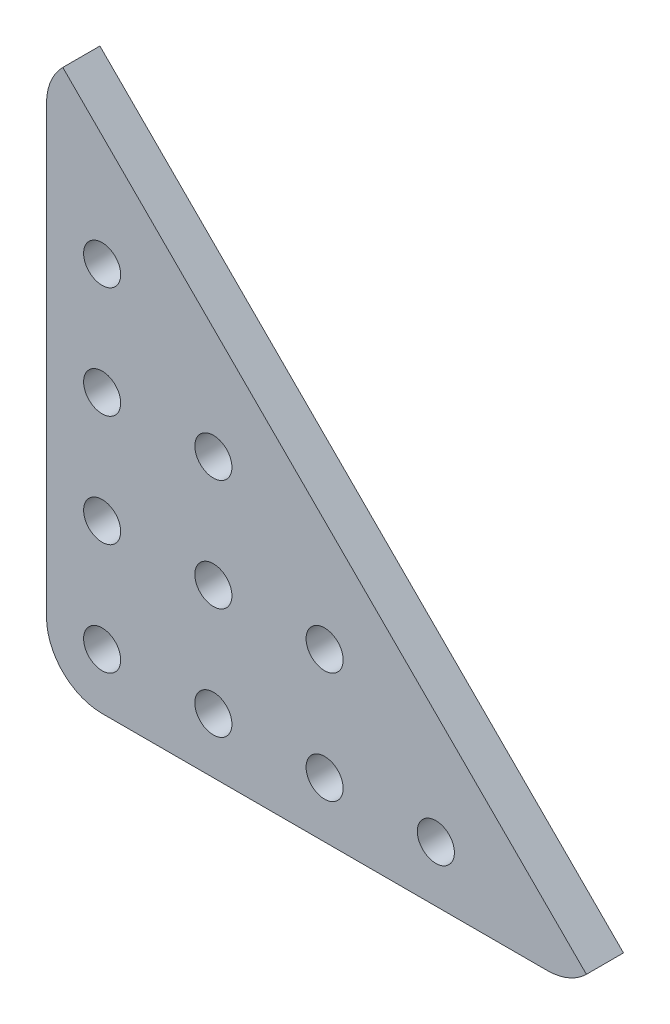
ISO-10303-21;
HEADER;
FILE_DESCRIPTION(('STEP AP214'),'2;1');
FILE_NAME('part.step','',(''),(''),'','','');
FILE_SCHEMA(('AUTOMOTIVE_DESIGN { 1 0 10303 214 1 1 1 1 }'));
ENDSEC;
DATA;
#1=APPLICATION_CONTEXT('core data for automotive mechanical design processes');
#2=APPLICATION_PROTOCOL_DEFINITION('international standard','automotive_design',2000,#1);
#3=PRODUCT_CONTEXT('',#1,'mechanical');
#4=PRODUCT('Part','Part','',(#3));
#5=PRODUCT_RELATED_PRODUCT_CATEGORY('part','',(#4));
#6=PRODUCT_DEFINITION_FORMATION('','',#4);
#7=PRODUCT_DEFINITION_CONTEXT('part definition',#1,'design');
#8=PRODUCT_DEFINITION('design','',#6,#7);
#9=PRODUCT_DEFINITION_SHAPE('','',#8);
#10=(LENGTH_UNIT() NAMED_UNIT(*) SI_UNIT(.MILLI.,.METRE.));
#11=(NAMED_UNIT(*) PLANE_ANGLE_UNIT() SI_UNIT($,.RADIAN.));
#12=(NAMED_UNIT(*) SI_UNIT($,.STERADIAN.) SOLID_ANGLE_UNIT());
#13=UNCERTAINTY_MEASURE_WITH_UNIT(LENGTH_MEASURE(1.E-05),#10,'distance_accuracy_value','');
#14=(GEOMETRIC_REPRESENTATION_CONTEXT(3) GLOBAL_UNCERTAINTY_ASSIGNED_CONTEXT((#13)) GLOBAL_UNIT_ASSIGNED_CONTEXT((#10,
#11,#12)) REPRESENTATION_CONTEXT('',''));
#15=CARTESIAN_POINT('',(0.,0.,0.));
#16=DIRECTION('',(0.,0.,1.));
#17=DIRECTION('',(1.,0.,0.));
#18=AXIS2_PLACEMENT_3D('',#15,#16,#17);
#19=CARTESIAN_POINT('',(-101.443383637,101.056539337921,3.));
#20=DIRECTION('',(0.,0.,1.));
#21=DIRECTION('',(1.,0.,0.));
#22=AXIS2_PLACEMENT_3D('',#19,#20,#21);
#23=PLANE('',#22);
#24=CARTESIAN_POINT('',(-83.443383637,65.056539338,3.));
#25=DIRECTION('',(0.,0.,1.));
#26=DIRECTION('',(1.,0.,0.));
#27=AXIS2_PLACEMENT_3D('',#24,#25,#26);
#28=CIRCLE('',#27,1.5);
#29=CARTESIAN_POINT('',(-81.943383637,65.056539338,3.));
#30=VERTEX_POINT('',#29);
#31=EDGE_CURVE('E214',#30,#30,#28,.T.);
#32=ORIENTED_EDGE('',*,*,#31,.F.);
#33=EDGE_LOOP('',(#32));
#34=FACE_BOUND('',#33,.T.);
#35=CARTESIAN_POINT('',(-101.443383637,65.056539338,3.));
#36=DIRECTION('',(0.,0.,1.));
#37=DIRECTION('',(1.,0.,0.));
#38=AXIS2_PLACEMENT_3D('',#35,#36,#37);
#39=CIRCLE('',#38,1.5);
#40=CARTESIAN_POINT('',(-99.943383637,65.056539338,3.));
#41=VERTEX_POINT('',#40);
#42=EDGE_CURVE('E226',#41,#41,#39,.T.);
#43=ORIENTED_EDGE('',*,*,#42,.F.);
#44=EDGE_LOOP('',(#43));
#45=FACE_BOUND('',#44,.T.);
#46=CARTESIAN_POINT('',(-92.443383637,74.056539338,3.));
#47=DIRECTION('',(0.,0.,1.));
#48=DIRECTION('',(1.,0.,0.));
#49=AXIS2_PLACEMENT_3D('',#46,#47,#48);
#50=CIRCLE('',#49,1.5);
#51=CARTESIAN_POINT('',(-90.943383637,74.056539338,3.));
#52=VERTEX_POINT('',#51);
#53=EDGE_CURVE('E238',#52,#52,#50,.T.);
#54=ORIENTED_EDGE('',*,*,#53,.F.);
#55=EDGE_LOOP('',(#54));
#56=FACE_BOUND('',#55,.T.);
#57=CARTESIAN_POINT('',(-92.443383637,83.056539338,3.));
#58=DIRECTION('',(0.,0.,1.));
#59=DIRECTION('',(1.,0.,0.));
#60=AXIS2_PLACEMENT_3D('',#57,#58,#59);
#61=CIRCLE('',#60,1.5);
#62=CARTESIAN_POINT('',(-90.943383637,83.056539338,3.));
#63=VERTEX_POINT('',#62);
#64=EDGE_CURVE('E250',#63,#63,#61,.T.);
#65=ORIENTED_EDGE('',*,*,#64,.F.);
#66=EDGE_LOOP('',(#65));
#67=FACE_BOUND('',#66,.T.);
#68=CARTESIAN_POINT('',(-101.443383637,92.056539338,3.));
#69=DIRECTION('',(0.,0.,1.));
#70=DIRECTION('',(1.,0.,0.));
#71=AXIS2_PLACEMENT_3D('',#68,#69,#70);
#72=CIRCLE('',#71,1.5);
#73=CARTESIAN_POINT('',(-99.943383637,92.056539338,3.));
#74=VERTEX_POINT('',#73);
#75=EDGE_CURVE('E122',#74,#74,#72,.T.);
#76=ORIENTED_EDGE('',*,*,#75,.F.);
#77=EDGE_LOOP('',(#76));
#78=FACE_BOUND('',#77,.T.);
#79=CARTESIAN_POINT('',(-101.443383637,101.056539337921,3.));
#80=DIRECTION('',(0.,0.,1.));
#81=DIRECTION('',(1.,0.,0.));
#82=AXIS2_PLACEMENT_3D('',#79,#80,#81);
#83=CIRCLE('',#82,4.50000000000001);
#84=CARTESIAN_POINT('',(-104.6253641523,104.2385198533,3.));
#85=VERTEX_POINT('',#84);
#86=CARTESIAN_POINT('',(-105.943383637,101.056539338,3.));
#87=VERTEX_POINT('',#86);
#88=EDGE_CURVE('E129',#85,#87,#83,.T.);
#89=ORIENTED_EDGE('',*,*,#88,.T.);
#90=DIRECTION('',(0.,-1.,0.));
#91=VECTOR('',#90,1.);
#92=CARTESIAN_POINT('',(-105.943383637,101.056539338,3.));
#93=LINE('',#92,#91);
#94=CARTESIAN_POINT('',(-105.943383637,65.056539338,3.));
#95=VERTEX_POINT('',#94);
#96=EDGE_CURVE('E87',#87,#95,#93,.T.);
#97=ORIENTED_EDGE('',*,*,#96,.T.);
#98=CARTESIAN_POINT('',(-101.443383637,65.056539338,3.));
#99=DIRECTION('',(0.,0.,1.));
#100=DIRECTION('',(1.,0.,0.));
#101=AXIS2_PLACEMENT_3D('',#98,#99,#100);
#102=CIRCLE('',#101,4.5);
#103=CARTESIAN_POINT('',(-101.443383637,60.556539338,3.));
#104=VERTEX_POINT('',#103);
#105=EDGE_CURVE('E100',#95,#104,#102,.T.);
#106=ORIENTED_EDGE('',*,*,#105,.T.);
#107=DIRECTION('',(1.,0.,0.));
#108=VECTOR('',#107,1.);
#109=CARTESIAN_POINT('',(-101.443383637,60.556539338,3.));
#110=LINE('',#109,#108);
#111=CARTESIAN_POINT('',(-65.443383637,60.556539338,3.));
#112=VERTEX_POINT('',#111);
#113=EDGE_CURVE('E94',#104,#112,#110,.T.);
#114=ORIENTED_EDGE('',*,*,#113,.T.);
#115=CARTESIAN_POINT('',(-65.4433836370789,65.056539338,3.));
#116=DIRECTION('',(0.,0.,1.));
#117=DIRECTION('',(1.,0.,0.));
#118=AXIS2_PLACEMENT_3D('',#115,#116,#117);
#119=CIRCLE('',#118,4.5);
#120=CARTESIAN_POINT('',(-62.2614031217,61.8745588227,3.));
#121=VERTEX_POINT('',#120);
#122=EDGE_CURVE('E98',#112,#121,#119,.T.);
#123=ORIENTED_EDGE('',*,*,#122,.T.);
#124=DIRECTION('',(-0.707106781186547,0.707106781186548,0.));
#125=VECTOR('',#124,1.);
#126=CARTESIAN_POINT('',(-104.6253641523,104.2385198533,3.));
#127=LINE('',#126,#125);
#128=EDGE_CURVE('E50',#121,#85,#127,.T.);
#129=ORIENTED_EDGE('',*,*,#128,.T.);
#130=EDGE_LOOP('',(#89,#97,#106,#114,#123,#129));
#131=FACE_BOUND('',#130,.T.);
#132=CARTESIAN_POINT('',(-101.443383637,83.056539338,3.));
#133=DIRECTION('',(0.,0.,1.));
#134=DIRECTION('',(1.,0.,0.));
#135=AXIS2_PLACEMENT_3D('',#132,#133,#134);
#136=CIRCLE('',#135,1.5);
#137=CARTESIAN_POINT('',(-99.943383637,83.056539338,3.));
#138=VERTEX_POINT('',#137);
#139=EDGE_CURVE('E256',#138,#138,#136,.T.);
#140=ORIENTED_EDGE('',*,*,#139,.F.);
#141=EDGE_LOOP('',(#140));
#142=FACE_BOUND('',#141,.T.);
#143=CARTESIAN_POINT('',(-101.443383637,74.056539338,3.));
#144=DIRECTION('',(0.,0.,1.));
#145=DIRECTION('',(1.,0.,0.));
#146=AXIS2_PLACEMENT_3D('',#143,#144,#145);
#147=CIRCLE('',#146,1.5);
#148=CARTESIAN_POINT('',(-99.943383637,74.056539338,3.));
#149=VERTEX_POINT('',#148);
#150=EDGE_CURVE('E244',#149,#149,#147,.T.);
#151=ORIENTED_EDGE('',*,*,#150,.F.);
#152=EDGE_LOOP('',(#151));
#153=FACE_BOUND('',#152,.T.);
#154=CARTESIAN_POINT('',(-83.443383637,74.056539338,3.));
#155=DIRECTION('',(0.,0.,1.));
#156=DIRECTION('',(1.,0.,0.));
#157=AXIS2_PLACEMENT_3D('',#154,#155,#156);
#158=CIRCLE('',#157,1.5);
#159=CARTESIAN_POINT('',(-81.943383637,74.056539338,3.));
#160=VERTEX_POINT('',#159);
#161=EDGE_CURVE('E232',#160,#160,#158,.T.);
#162=ORIENTED_EDGE('',*,*,#161,.F.);
#163=EDGE_LOOP('',(#162));
#164=FACE_BOUND('',#163,.T.);
#165=CARTESIAN_POINT('',(-92.443383637,65.056539338,3.));
#166=DIRECTION('',(0.,0.,1.));
#167=DIRECTION('',(1.,0.,0.));
#168=AXIS2_PLACEMENT_3D('',#165,#166,#167);
#169=CIRCLE('',#168,1.5);
#170=CARTESIAN_POINT('',(-90.943383637,65.056539338,3.));
#171=VERTEX_POINT('',#170);
#172=EDGE_CURVE('E220',#171,#171,#169,.T.);
#173=ORIENTED_EDGE('',*,*,#172,.F.);
#174=EDGE_LOOP('',(#173));
#175=FACE_BOUND('',#174,.T.);
#176=CARTESIAN_POINT('',(-74.443383637,65.056539338,3.));
#177=DIRECTION('',(0.,0.,1.));
#178=DIRECTION('',(1.,0.,0.));
#179=AXIS2_PLACEMENT_3D('',#176,#177,#178);
#180=CIRCLE('',#179,1.5);
#181=CARTESIAN_POINT('',(-72.943383637,65.056539338,3.));
#182=VERTEX_POINT('',#181);
#183=EDGE_CURVE('E205',#182,#182,#180,.T.);
#184=ORIENTED_EDGE('',*,*,#183,.F.);
#185=EDGE_LOOP('',(#184));
#186=FACE_BOUND('',#185,.T.);
#187=ADVANCED_FACE('F33',(#34,#45,#56,#67,#78,#131,#142,#153,#164,#175,#186),#23,.T.);
#188=CARTESIAN_POINT('',(-101.443383637,101.056539337921,0.));
#189=DIRECTION('',(0.,0.,1.));
#190=DIRECTION('',(1.,0.,0.));
#191=AXIS2_PLACEMENT_3D('',#188,#189,#190);
#192=PLANE('',#191);
#193=CARTESIAN_POINT('',(-83.443383637,65.056539338,0.));
#194=DIRECTION('',(0.,0.,1.));
#195=DIRECTION('',(1.,0.,0.));
#196=AXIS2_PLACEMENT_3D('',#193,#194,#195);
#197=CIRCLE('',#196,1.5);
#198=CARTESIAN_POINT('',(-81.943383637,65.056539338,0.));
#199=VERTEX_POINT('',#198);
#200=EDGE_CURVE('E211',#199,#199,#197,.T.);
#201=ORIENTED_EDGE('',*,*,#200,.T.);
#202=EDGE_LOOP('',(#201));
#203=FACE_BOUND('',#202,.T.);
#204=CARTESIAN_POINT('',(-101.443383637,65.056539338,0.));
#205=DIRECTION('',(0.,0.,1.));
#206=DIRECTION('',(1.,0.,0.));
#207=AXIS2_PLACEMENT_3D('',#204,#205,#206);
#208=CIRCLE('',#207,1.5);
#209=CARTESIAN_POINT('',(-99.943383637,65.056539338,0.));
#210=VERTEX_POINT('',#209);
#211=EDGE_CURVE('E223',#210,#210,#208,.T.);
#212=ORIENTED_EDGE('',*,*,#211,.T.);
#213=EDGE_LOOP('',(#212));
#214=FACE_BOUND('',#213,.T.);
#215=CARTESIAN_POINT('',(-92.443383637,74.056539338,0.));
#216=DIRECTION('',(0.,0.,1.));
#217=DIRECTION('',(1.,0.,0.));
#218=AXIS2_PLACEMENT_3D('',#215,#216,#217);
#219=CIRCLE('',#218,1.5);
#220=CARTESIAN_POINT('',(-90.943383637,74.056539338,0.));
#221=VERTEX_POINT('',#220);
#222=EDGE_CURVE('E235',#221,#221,#219,.T.);
#223=ORIENTED_EDGE('',*,*,#222,.T.);
#224=EDGE_LOOP('',(#223));
#225=FACE_BOUND('',#224,.T.);
#226=CARTESIAN_POINT('',(-92.443383637,83.056539338,0.));
#227=DIRECTION('',(0.,0.,1.));
#228=DIRECTION('',(1.,0.,0.));
#229=AXIS2_PLACEMENT_3D('',#226,#227,#228);
#230=CIRCLE('',#229,1.5);
#231=CARTESIAN_POINT('',(-90.943383637,83.056539338,0.));
#232=VERTEX_POINT('',#231);
#233=EDGE_CURVE('E247',#232,#232,#230,.T.);
#234=ORIENTED_EDGE('',*,*,#233,.T.);
#235=EDGE_LOOP('',(#234));
#236=FACE_BOUND('',#235,.T.);
#237=CARTESIAN_POINT('',(-101.443383637,92.056539338,0.));
#238=DIRECTION('',(0.,0.,1.));
#239=DIRECTION('',(1.,0.,0.));
#240=AXIS2_PLACEMENT_3D('',#237,#238,#239);
#241=CIRCLE('',#240,1.5);
#242=CARTESIAN_POINT('',(-99.943383637,92.056539338,0.));
#243=VERTEX_POINT('',#242);
#244=EDGE_CURVE('E259',#243,#243,#241,.T.);
#245=ORIENTED_EDGE('',*,*,#244,.T.);
#246=EDGE_LOOP('',(#245));
#247=FACE_BOUND('',#246,.T.);
#248=CARTESIAN_POINT('',(-101.443383637,101.056539337921,0.));
#249=DIRECTION('',(0.,0.,1.));
#250=DIRECTION('',(1.,0.,0.));
#251=AXIS2_PLACEMENT_3D('',#248,#249,#250);
#252=CIRCLE('',#251,4.50000000000001);
#253=CARTESIAN_POINT('',(-104.6253641523,104.2385198533,0.));
#254=VERTEX_POINT('',#253);
#255=CARTESIAN_POINT('',(-105.943383637,101.056539338,0.));
#256=VERTEX_POINT('',#255);
#257=EDGE_CURVE('E118',#254,#256,#252,.T.);
#258=ORIENTED_EDGE('',*,*,#257,.F.);
#259=DIRECTION('',(-0.707106781186547,0.707106781186548,0.));
#260=VECTOR('',#259,1.);
#261=CARTESIAN_POINT('',(-104.6253641523,104.2385198533,0.));
#262=LINE('',#261,#260);
#263=CARTESIAN_POINT('',(-62.2614031217,61.8745588227,0.));
#264=VERTEX_POINT('',#263);
#265=EDGE_CURVE('E79',#264,#254,#262,.T.);
#266=ORIENTED_EDGE('',*,*,#265,.F.);
#267=CARTESIAN_POINT('',(-65.4433836370789,65.056539338,0.));
#268=DIRECTION('',(0.,0.,1.));
#269=DIRECTION('',(1.,0.,0.));
#270=AXIS2_PLACEMENT_3D('',#267,#268,#269);
#271=CIRCLE('',#270,4.5);
#272=CARTESIAN_POINT('',(-65.443383637,60.556539338,0.));
#273=VERTEX_POINT('',#272);
#274=EDGE_CURVE('E73',#273,#264,#271,.T.);
#275=ORIENTED_EDGE('',*,*,#274,.F.);
#276=DIRECTION('',(1.,0.,0.));
#277=VECTOR('',#276,1.);
#278=CARTESIAN_POINT('',(-101.443383637,60.556539338,0.));
#279=LINE('',#278,#277);
#280=CARTESIAN_POINT('',(-101.443383637,60.556539338,0.));
#281=VERTEX_POINT('',#280);
#282=EDGE_CURVE('E108',#281,#273,#279,.T.);
#283=ORIENTED_EDGE('',*,*,#282,.F.);
#284=CARTESIAN_POINT('',(-101.443383637,65.056539338,0.));
#285=DIRECTION('',(0.,0.,1.));
#286=DIRECTION('',(1.,0.,0.));
#287=AXIS2_PLACEMENT_3D('',#284,#285,#286);
#288=CIRCLE('',#287,4.5);
#289=CARTESIAN_POINT('',(-105.943383637,65.056539338,0.));
#290=VERTEX_POINT('',#289);
#291=EDGE_CURVE('E124',#290,#281,#288,.T.);
#292=ORIENTED_EDGE('',*,*,#291,.F.);
#293=DIRECTION('',(0.,-1.,0.));
#294=VECTOR('',#293,1.);
#295=CARTESIAN_POINT('',(-105.943383637,101.056539338,0.));
#296=LINE('',#295,#294);
#297=EDGE_CURVE('E121',#256,#290,#296,.T.);
#298=ORIENTED_EDGE('',*,*,#297,.F.);
#299=EDGE_LOOP('',(#258,#266,#275,#283,#292,#298));
#300=FACE_BOUND('',#299,.T.);
#301=CARTESIAN_POINT('',(-101.443383637,83.056539338,0.));
#302=DIRECTION('',(0.,0.,1.));
#303=DIRECTION('',(1.,0.,0.));
#304=AXIS2_PLACEMENT_3D('',#301,#302,#303);
#305=CIRCLE('',#304,1.5);
#306=CARTESIAN_POINT('',(-99.943383637,83.056539338,0.));
#307=VERTEX_POINT('',#306);
#308=EDGE_CURVE('E253',#307,#307,#305,.T.);
#309=ORIENTED_EDGE('',*,*,#308,.T.);
#310=EDGE_LOOP('',(#309));
#311=FACE_BOUND('',#310,.T.);
#312=CARTESIAN_POINT('',(-101.443383637,74.056539338,0.));
#313=DIRECTION('',(0.,0.,1.));
#314=DIRECTION('',(1.,0.,0.));
#315=AXIS2_PLACEMENT_3D('',#312,#313,#314);
#316=CIRCLE('',#315,1.5);
#317=CARTESIAN_POINT('',(-99.943383637,74.056539338,0.));
#318=VERTEX_POINT('',#317);
#319=EDGE_CURVE('E241',#318,#318,#316,.T.);
#320=ORIENTED_EDGE('',*,*,#319,.T.);
#321=EDGE_LOOP('',(#320));
#322=FACE_BOUND('',#321,.T.);
#323=CARTESIAN_POINT('',(-83.443383637,74.056539338,0.));
#324=DIRECTION('',(0.,0.,1.));
#325=DIRECTION('',(1.,0.,0.));
#326=AXIS2_PLACEMENT_3D('',#323,#324,#325);
#327=CIRCLE('',#326,1.5);
#328=CARTESIAN_POINT('',(-81.943383637,74.056539338,0.));
#329=VERTEX_POINT('',#328);
#330=EDGE_CURVE('E229',#329,#329,#327,.T.);
#331=ORIENTED_EDGE('',*,*,#330,.T.);
#332=EDGE_LOOP('',(#331));
#333=FACE_BOUND('',#332,.T.);
#334=CARTESIAN_POINT('',(-92.443383637,65.056539338,0.));
#335=DIRECTION('',(0.,0.,1.));
#336=DIRECTION('',(1.,0.,0.));
#337=AXIS2_PLACEMENT_3D('',#334,#335,#336);
#338=CIRCLE('',#337,1.5);
#339=CARTESIAN_POINT('',(-90.943383637,65.056539338,0.));
#340=VERTEX_POINT('',#339);
#341=EDGE_CURVE('E217',#340,#340,#338,.T.);
#342=ORIENTED_EDGE('',*,*,#341,.T.);
#343=EDGE_LOOP('',(#342));
#344=FACE_BOUND('',#343,.T.);
#345=CARTESIAN_POINT('',(-74.443383637,65.056539338,0.));
#346=DIRECTION('',(0.,0.,1.));
#347=DIRECTION('',(1.,0.,0.));
#348=AXIS2_PLACEMENT_3D('',#345,#346,#347);
#349=CIRCLE('',#348,1.5);
#350=CARTESIAN_POINT('',(-72.943383637,65.056539338,0.));
#351=VERTEX_POINT('',#350);
#352=EDGE_CURVE('E208',#351,#351,#349,.T.);
#353=ORIENTED_EDGE('',*,*,#352,.T.);
#354=EDGE_LOOP('',(#353));
#355=FACE_BOUND('',#354,.T.);
#356=ADVANCED_FACE('F138',(#203,#214,#225,#236,#247,#300,#311,#322,#333,#344,#355),#192,.F.);
#357=CARTESIAN_POINT('',(-101.443383637,101.056539337921,3.));
#358=DIRECTION('',(0.,0.,-1.));
#359=DIRECTION('',(-1.,0.,0.));
#360=AXIS2_PLACEMENT_3D('',#357,#358,#359);
#361=CYLINDRICAL_SURFACE('',#360,4.50000000000001);
#362=ORIENTED_EDGE('',*,*,#257,.T.);
#363=DIRECTION('',(0.,0.,-1.));
#364=VECTOR('',#363,1.);
#365=CARTESIAN_POINT('',(-105.943383637,101.056539338,3.));
#366=LINE('',#365,#364);
#367=EDGE_CURVE('E11',#87,#256,#366,.T.);
#368=ORIENTED_EDGE('',*,*,#367,.F.);
#369=ORIENTED_EDGE('',*,*,#88,.F.);
#370=DIRECTION('',(0.,0.,-1.));
#371=VECTOR('',#370,1.);
#372=CARTESIAN_POINT('',(-104.6253641523,104.2385198533,3.));
#373=LINE('',#372,#371);
#374=EDGE_CURVE('E114',#85,#254,#373,.T.);
#375=ORIENTED_EDGE('',*,*,#374,.T.);
#376=EDGE_LOOP('',(#362,#368,#369,#375));
#377=FACE_BOUND('',#376,.T.);
#378=ADVANCED_FACE('F35',(#377),#361,.T.);
#379=CARTESIAN_POINT('',(-105.943383637,101.056539338,3.));
#380=DIRECTION('',(1.,0.,0.));
#381=DIRECTION('',(0.,0.,-1.));
#382=AXIS2_PLACEMENT_3D('',#379,#380,#381);
#383=PLANE('',#382);
#384=ORIENTED_EDGE('',*,*,#297,.T.);
#385=DIRECTION('',(0.,0.,-1.));
#386=VECTOR('',#385,1.);
#387=CARTESIAN_POINT('',(-105.943383637,65.056539338,3.));
#388=LINE('',#387,#386);
#389=EDGE_CURVE('E42',#95,#290,#388,.T.);
#390=ORIENTED_EDGE('',*,*,#389,.F.);
#391=ORIENTED_EDGE('',*,*,#96,.F.);
#392=ORIENTED_EDGE('',*,*,#367,.T.);
#393=EDGE_LOOP('',(#384,#390,#391,#392));
#394=FACE_BOUND('',#393,.T.);
#395=ADVANCED_FACE('F370',(#394),#383,.F.);
#396=CARTESIAN_POINT('',(-101.443383637,65.056539338,3.));
#397=DIRECTION('',(0.,0.,-1.));
#398=DIRECTION('',(-1.,0.,0.));
#399=AXIS2_PLACEMENT_3D('',#396,#397,#398);
#400=CYLINDRICAL_SURFACE('',#399,4.5);
#401=ORIENTED_EDGE('',*,*,#291,.T.);
#402=DIRECTION('',(0.,0.,-1.));
#403=VECTOR('',#402,1.);
#404=CARTESIAN_POINT('',(-101.443383637,60.556539338,3.));
#405=LINE('',#404,#403);
#406=EDGE_CURVE('E109',#104,#281,#405,.T.);
#407=ORIENTED_EDGE('',*,*,#406,.F.);
#408=ORIENTED_EDGE('',*,*,#105,.F.);
#409=ORIENTED_EDGE('',*,*,#389,.T.);
#410=EDGE_LOOP('',(#401,#407,#408,#409));
#411=FACE_BOUND('',#410,.T.);
#412=ADVANCED_FACE('F135',(#411),#400,.T.);
#413=CARTESIAN_POINT('',(-101.443383637,60.556539338,3.));
#414=DIRECTION('',(0.,1.,0.));
#415=DIRECTION('',(0.,0.,1.));
#416=AXIS2_PLACEMENT_3D('',#413,#414,#415);
#417=PLANE('',#416);
#418=ORIENTED_EDGE('',*,*,#282,.T.);
#419=DIRECTION('',(0.,0.,-1.));
#420=VECTOR('',#419,1.);
#421=CARTESIAN_POINT('',(-65.443383637,60.556539338,3.));
#422=LINE('',#421,#420);
#423=EDGE_CURVE('E105',#112,#273,#422,.T.);
#424=ORIENTED_EDGE('',*,*,#423,.F.);
#425=ORIENTED_EDGE('',*,*,#113,.F.);
#426=ORIENTED_EDGE('',*,*,#406,.T.);
#427=EDGE_LOOP('',(#418,#424,#425,#426));
#428=FACE_BOUND('',#427,.T.);
#429=ADVANCED_FACE('F106',(#428),#417,.F.);
#430=CARTESIAN_POINT('',(-65.4433836370789,65.056539338,3.));
#431=DIRECTION('',(0.,0.,-1.));
#432=DIRECTION('',(-1.,0.,0.));
#433=AXIS2_PLACEMENT_3D('',#430,#431,#432);
#434=CYLINDRICAL_SURFACE('',#433,4.5);
#435=ORIENTED_EDGE('',*,*,#274,.T.);
#436=DIRECTION('',(0.,0.,-1.));
#437=VECTOR('',#436,1.);
#438=CARTESIAN_POINT('',(-62.2614031217,61.8745588227,3.));
#439=LINE('',#438,#437);
#440=EDGE_CURVE('E110',#121,#264,#439,.T.);
#441=ORIENTED_EDGE('',*,*,#440,.F.);
#442=ORIENTED_EDGE('',*,*,#122,.F.);
#443=ORIENTED_EDGE('',*,*,#423,.T.);
#444=EDGE_LOOP('',(#435,#441,#442,#443));
#445=FACE_BOUND('',#444,.T.);
#446=ADVANCED_FACE('F112',(#445),#434,.T.);
#447=CARTESIAN_POINT('',(-104.6253641523,104.2385198533,3.));
#448=DIRECTION('',(-0.707106781186548,-0.707106781186547,0.));
#449=DIRECTION('',(0.707106781186547,-0.707106781186548,0.));
#450=AXIS2_PLACEMENT_3D('',#447,#448,#449);
#451=PLANE('',#450);
#452=ORIENTED_EDGE('',*,*,#265,.T.);
#453=ORIENTED_EDGE('',*,*,#374,.F.);
#454=ORIENTED_EDGE('',*,*,#128,.F.);
#455=ORIENTED_EDGE('',*,*,#440,.T.);
#456=EDGE_LOOP('',(#452,#453,#454,#455));
#457=FACE_BOUND('',#456,.T.);
#458=ADVANCED_FACE('F143',(#457),#451,.F.);
#459=CARTESIAN_POINT('',(-101.443383637,92.056539338,3.));
#460=DIRECTION('',(0.,0.,-1.));
#461=DIRECTION('',(-1.,0.,0.));
#462=AXIS2_PLACEMENT_3D('',#459,#460,#461);
#463=CYLINDRICAL_SURFACE('',#462,1.5);
#464=ORIENTED_EDGE('',*,*,#75,.T.);
#465=EDGE_LOOP('',(#464));
#466=FACE_BOUND('',#465,.T.);
#467=ORIENTED_EDGE('',*,*,#244,.F.);
#468=EDGE_LOOP('',(#467));
#469=FACE_BOUND('',#468,.T.);
#470=ADVANCED_FACE('F145',(#466,#469),#463,.F.);
#471=CARTESIAN_POINT('',(-101.443383637,83.056539338,3.));
#472=DIRECTION('',(0.,0.,-1.));
#473=DIRECTION('',(-1.,0.,0.));
#474=AXIS2_PLACEMENT_3D('',#471,#472,#473);
#475=CYLINDRICAL_SURFACE('',#474,1.5);
#476=ORIENTED_EDGE('',*,*,#139,.T.);
#477=EDGE_LOOP('',(#476));
#478=FACE_BOUND('',#477,.T.);
#479=ORIENTED_EDGE('',*,*,#308,.F.);
#480=EDGE_LOOP('',(#479));
#481=FACE_BOUND('',#480,.T.);
#482=ADVANCED_FACE('F151',(#478,#481),#475,.F.);
#483=CARTESIAN_POINT('',(-92.443383637,83.056539338,3.));
#484=DIRECTION('',(0.,0.,-1.));
#485=DIRECTION('',(-1.,0.,0.));
#486=AXIS2_PLACEMENT_3D('',#483,#484,#485);
#487=CYLINDRICAL_SURFACE('',#486,1.5);
#488=ORIENTED_EDGE('',*,*,#64,.T.);
#489=EDGE_LOOP('',(#488));
#490=FACE_BOUND('',#489,.T.);
#491=ORIENTED_EDGE('',*,*,#233,.F.);
#492=EDGE_LOOP('',(#491));
#493=FACE_BOUND('',#492,.T.);
#494=ADVANCED_FACE('F168',(#490,#493),#487,.F.);
#495=CARTESIAN_POINT('',(-101.443383637,74.056539338,3.));
#496=DIRECTION('',(0.,0.,-1.));
#497=DIRECTION('',(-1.,0.,0.));
#498=AXIS2_PLACEMENT_3D('',#495,#496,#497);
#499=CYLINDRICAL_SURFACE('',#498,1.5);
#500=ORIENTED_EDGE('',*,*,#150,.T.);
#501=EDGE_LOOP('',(#500));
#502=FACE_BOUND('',#501,.T.);
#503=ORIENTED_EDGE('',*,*,#319,.F.);
#504=EDGE_LOOP('',(#503));
#505=FACE_BOUND('',#504,.T.);
#506=ADVANCED_FACE('F172',(#502,#505),#499,.F.);
#507=CARTESIAN_POINT('',(-92.443383637,74.056539338,3.));
#508=DIRECTION('',(0.,0.,-1.));
#509=DIRECTION('',(-1.,0.,0.));
#510=AXIS2_PLACEMENT_3D('',#507,#508,#509);
#511=CYLINDRICAL_SURFACE('',#510,1.5);
#512=ORIENTED_EDGE('',*,*,#53,.T.);
#513=EDGE_LOOP('',(#512));
#514=FACE_BOUND('',#513,.T.);
#515=ORIENTED_EDGE('',*,*,#222,.F.);
#516=EDGE_LOOP('',(#515));
#517=FACE_BOUND('',#516,.T.);
#518=ADVANCED_FACE('F176',(#514,#517),#511,.F.);
#519=CARTESIAN_POINT('',(-83.443383637,74.056539338,3.));
#520=DIRECTION('',(0.,0.,-1.));
#521=DIRECTION('',(-1.,0.,0.));
#522=AXIS2_PLACEMENT_3D('',#519,#520,#521);
#523=CYLINDRICAL_SURFACE('',#522,1.5);
#524=ORIENTED_EDGE('',*,*,#161,.T.);
#525=EDGE_LOOP('',(#524));
#526=FACE_BOUND('',#525,.T.);
#527=ORIENTED_EDGE('',*,*,#330,.F.);
#528=EDGE_LOOP('',(#527));
#529=FACE_BOUND('',#528,.T.);
#530=ADVANCED_FACE('F180',(#526,#529),#523,.F.);
#531=CARTESIAN_POINT('',(-101.443383637,65.056539338,3.));
#532=DIRECTION('',(0.,0.,-1.));
#533=DIRECTION('',(-1.,0.,0.));
#534=AXIS2_PLACEMENT_3D('',#531,#532,#533);
#535=CYLINDRICAL_SURFACE('',#534,1.5);
#536=ORIENTED_EDGE('',*,*,#42,.T.);
#537=EDGE_LOOP('',(#536));
#538=FACE_BOUND('',#537,.T.);
#539=ORIENTED_EDGE('',*,*,#211,.F.);
#540=EDGE_LOOP('',(#539));
#541=FACE_BOUND('',#540,.T.);
#542=ADVANCED_FACE('F184',(#538,#541),#535,.F.);
#543=CARTESIAN_POINT('',(-92.443383637,65.056539338,3.));
#544=DIRECTION('',(0.,0.,-1.));
#545=DIRECTION('',(-1.,0.,0.));
#546=AXIS2_PLACEMENT_3D('',#543,#544,#545);
#547=CYLINDRICAL_SURFACE('',#546,1.5);
#548=ORIENTED_EDGE('',*,*,#172,.T.);
#549=EDGE_LOOP('',(#548));
#550=FACE_BOUND('',#549,.T.);
#551=ORIENTED_EDGE('',*,*,#341,.F.);
#552=EDGE_LOOP('',(#551));
#553=FACE_BOUND('',#552,.T.);
#554=ADVANCED_FACE('F188',(#550,#553),#547,.F.);
#555=CARTESIAN_POINT('',(-83.443383637,65.056539338,3.));
#556=DIRECTION('',(0.,0.,-1.));
#557=DIRECTION('',(-1.,0.,0.));
#558=AXIS2_PLACEMENT_3D('',#555,#556,#557);
#559=CYLINDRICAL_SURFACE('',#558,1.5);
#560=ORIENTED_EDGE('',*,*,#31,.T.);
#561=EDGE_LOOP('',(#560));
#562=FACE_BOUND('',#561,.T.);
#563=ORIENTED_EDGE('',*,*,#200,.F.);
#564=EDGE_LOOP('',(#563));
#565=FACE_BOUND('',#564,.T.);
#566=ADVANCED_FACE('F192',(#562,#565),#559,.F.);
#567=CARTESIAN_POINT('',(-74.443383637,65.056539338,3.));
#568=DIRECTION('',(0.,0.,-1.));
#569=DIRECTION('',(-1.,0.,0.));
#570=AXIS2_PLACEMENT_3D('',#567,#568,#569);
#571=CYLINDRICAL_SURFACE('',#570,1.5);
#572=ORIENTED_EDGE('',*,*,#183,.T.);
#573=EDGE_LOOP('',(#572));
#574=FACE_BOUND('',#573,.T.);
#575=ORIENTED_EDGE('',*,*,#352,.F.);
#576=EDGE_LOOP('',(#575));
#577=FACE_BOUND('',#576,.T.);
#578=ADVANCED_FACE('F196',(#574,#577),#571,.F.);
#579=CLOSED_SHELL('',(#187,#356,#378,#395,#412,#429,#446,#458,#470,#482,#494,#506,#518,#530,
#542,#554,#566,#578));
#580=MANIFOLD_SOLID_BREP('B2',#579);
#581=ADVANCED_BREP_SHAPE_REPRESENTATION('',(#18,#580),#14);
#582=SHAPE_DEFINITION_REPRESENTATION(#9,#581);
ENDSEC;
END-ISO-10303-21;
